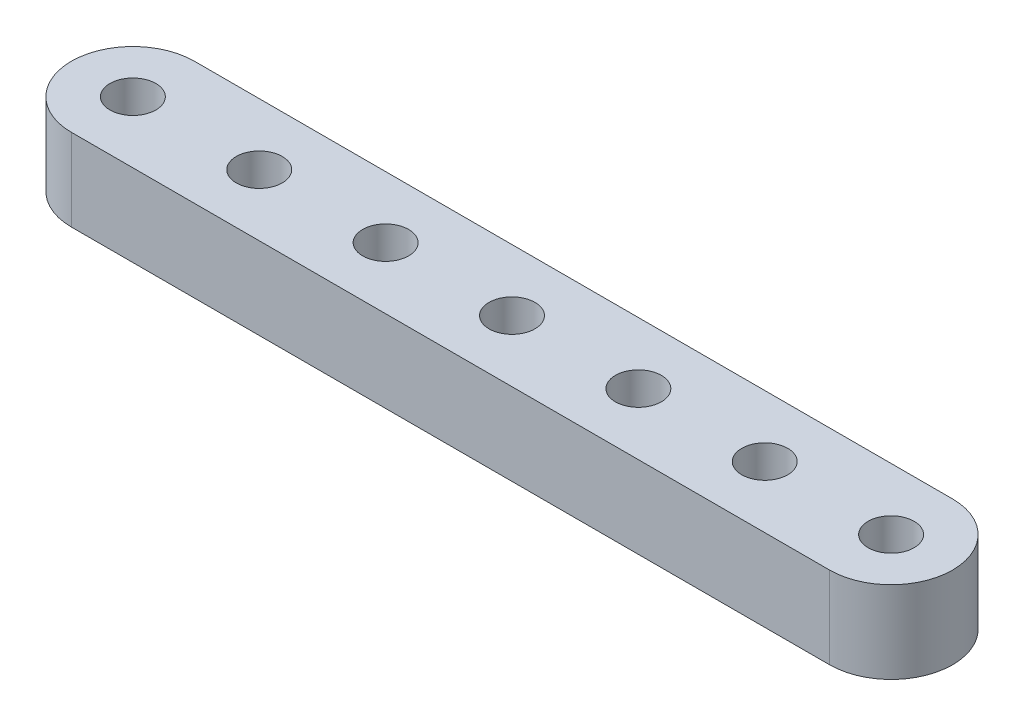
ISO-10303-21;
HEADER;
FILE_DESCRIPTION(('STEP AP214'),'2;1');
FILE_NAME('part.step','',(''),(''),'','','');
FILE_SCHEMA(('AUTOMOTIVE_DESIGN { 1 0 10303 214 1 1 1 1 }'));
ENDSEC;
DATA;
#1=APPLICATION_CONTEXT('core data for automotive mechanical design processes');
#2=APPLICATION_PROTOCOL_DEFINITION('international standard','automotive_design',2000,#1);
#3=PRODUCT_CONTEXT('',#1,'mechanical');
#4=PRODUCT('Part','Part','',(#3));
#5=PRODUCT_RELATED_PRODUCT_CATEGORY('part','',(#4));
#6=PRODUCT_DEFINITION_FORMATION('','',#4);
#7=PRODUCT_DEFINITION_CONTEXT('part definition',#1,'design');
#8=PRODUCT_DEFINITION('design','',#6,#7);
#9=PRODUCT_DEFINITION_SHAPE('','',#8);
#10=(LENGTH_UNIT() NAMED_UNIT(*) SI_UNIT(.MILLI.,.METRE.));
#11=(NAMED_UNIT(*) PLANE_ANGLE_UNIT() SI_UNIT($,.RADIAN.));
#12=(NAMED_UNIT(*) SI_UNIT($,.STERADIAN.) SOLID_ANGLE_UNIT());
#13=UNCERTAINTY_MEASURE_WITH_UNIT(LENGTH_MEASURE(1.E-05),#10,'distance_accuracy_value','');
#14=(GEOMETRIC_REPRESENTATION_CONTEXT(3) GLOBAL_UNCERTAINTY_ASSIGNED_CONTEXT((#13)) GLOBAL_UNIT_ASSIGNED_CONTEXT((#10,
#11,#12)) REPRESENTATION_CONTEXT('',''));
#15=CARTESIAN_POINT('',(0.,0.,0.));
#16=DIRECTION('',(0.,0.,1.));
#17=DIRECTION('',(1.,0.,0.));
#18=AXIS2_PLACEMENT_3D('',#15,#16,#17);
#19=CARTESIAN_POINT('',(-29.337,6.35,0.));
#20=DIRECTION('',(0.,-1.,0.));
#21=DIRECTION('',(0.,0.,-1.));
#22=AXIS2_PLACEMENT_3D('',#19,#20,#21);
#23=CYLINDRICAL_SURFACE('',#22,4.76250000000001);
#24=CARTESIAN_POINT('',(-29.337,0.,0.));
#25=DIRECTION('',(0.,-1.,0.));
#26=DIRECTION('',(0.,0.,-1.));
#27=AXIS2_PLACEMENT_3D('',#24,#25,#26);
#28=CIRCLE('',#27,4.76250000000001);
#29=CARTESIAN_POINT('',(-29.337,0.,4.76250000000001));
#30=VERTEX_POINT('',#29);
#31=CARTESIAN_POINT('',(-29.337,0.,-4.76250000000001));
#32=VERTEX_POINT('',#31);
#33=EDGE_CURVE('E97',#30,#32,#28,.T.);
#34=ORIENTED_EDGE('',*,*,#33,.F.);
#35=DIRECTION('',(0.,-1.,0.));
#36=VECTOR('',#35,1.);
#37=CARTESIAN_POINT('',(-29.337,6.35,4.76250000000001));
#38=LINE('',#37,#36);
#39=CARTESIAN_POINT('',(-29.337,6.35,4.76250000000001));
#40=VERTEX_POINT('',#39);
#41=EDGE_CURVE('E11',#40,#30,#38,.T.);
#42=ORIENTED_EDGE('',*,*,#41,.F.);
#43=CARTESIAN_POINT('',(-29.337,6.35,0.));
#44=DIRECTION('',(0.,-1.,0.));
#45=DIRECTION('',(0.,0.,-1.));
#46=AXIS2_PLACEMENT_3D('',#43,#44,#45);
#47=CIRCLE('',#46,4.76250000000001);
#48=CARTESIAN_POINT('',(-29.337,6.35,-4.76250000000001));
#49=VERTEX_POINT('',#48);
#50=EDGE_CURVE('E90',#40,#49,#47,.T.);
#51=ORIENTED_EDGE('',*,*,#50,.T.);
#52=DIRECTION('',(0.,-1.,0.));
#53=VECTOR('',#52,1.);
#54=CARTESIAN_POINT('',(-29.337,6.35,-4.76250000000001));
#55=LINE('',#54,#53);
#56=EDGE_CURVE('E35',#49,#32,#55,.T.);
#57=ORIENTED_EDGE('',*,*,#56,.T.);
#58=EDGE_LOOP('',(#34,#42,#51,#57));
#59=FACE_BOUND('',#58,.T.);
#60=ADVANCED_FACE('F32',(#59),#23,.T.);
#61=CARTESIAN_POINT('',(29.337,6.35,4.76250000000001));
#62=DIRECTION('',(0.,0.,1.));
#63=DIRECTION('',(1.,0.,0.));
#64=AXIS2_PLACEMENT_3D('',#61,#62,#63);
#65=PLANE('',#64);
#66=DIRECTION('',(-1.,0.,0.));
#67=VECTOR('',#66,1.);
#68=CARTESIAN_POINT('',(29.337,0.,4.76250000000001));
#69=LINE('',#68,#67);
#70=CARTESIAN_POINT('',(29.337,0.,4.76250000000001));
#71=VERTEX_POINT('',#70);
#72=EDGE_CURVE('E92',#71,#30,#69,.T.);
#73=ORIENTED_EDGE('',*,*,#72,.F.);
#74=DIRECTION('',(0.,-1.,0.));
#75=VECTOR('',#74,1.);
#76=CARTESIAN_POINT('',(29.337,6.35,4.76250000000001));
#77=LINE('',#76,#75);
#78=CARTESIAN_POINT('',(29.337,6.35,4.76250000000001));
#79=VERTEX_POINT('',#78);
#80=EDGE_CURVE('E41',#79,#71,#77,.T.);
#81=ORIENTED_EDGE('',*,*,#80,.F.);
#82=DIRECTION('',(-1.,0.,0.));
#83=VECTOR('',#82,1.);
#84=CARTESIAN_POINT('',(29.337,6.35,4.76250000000001));
#85=LINE('',#84,#83);
#86=EDGE_CURVE('E87',#79,#40,#85,.T.);
#87=ORIENTED_EDGE('',*,*,#86,.T.);
#88=ORIENTED_EDGE('',*,*,#41,.T.);
#89=EDGE_LOOP('',(#73,#81,#87,#88));
#90=FACE_BOUND('',#89,.T.);
#91=ADVANCED_FACE('F108',(#90),#65,.T.);
#92=CARTESIAN_POINT('',(29.337,6.35,0.));
#93=DIRECTION('',(0.,-1.,0.));
#94=DIRECTION('',(0.,0.,-1.));
#95=AXIS2_PLACEMENT_3D('',#92,#93,#94);
#96=CYLINDRICAL_SURFACE('',#95,4.76250000000001);
#97=CARTESIAN_POINT('',(29.337,0.,0.));
#98=DIRECTION('',(0.,-1.,0.));
#99=DIRECTION('',(0.,0.,-1.));
#100=AXIS2_PLACEMENT_3D('',#97,#98,#99);
#101=CIRCLE('',#100,4.76250000000001);
#102=CARTESIAN_POINT('',(29.337,0.,-4.76250000000001));
#103=VERTEX_POINT('',#102);
#104=EDGE_CURVE('E82',#103,#71,#101,.T.);
#105=ORIENTED_EDGE('',*,*,#104,.F.);
#106=DIRECTION('',(0.,-1.,0.));
#107=VECTOR('',#106,1.);
#108=CARTESIAN_POINT('',(29.337,6.35,-4.76250000000001));
#109=LINE('',#108,#107);
#110=CARTESIAN_POINT('',(29.337,6.35,-4.76250000000001));
#111=VERTEX_POINT('',#110);
#112=EDGE_CURVE('E77',#111,#103,#109,.T.);
#113=ORIENTED_EDGE('',*,*,#112,.F.);
#114=CARTESIAN_POINT('',(29.337,6.35,0.));
#115=DIRECTION('',(0.,-1.,0.));
#116=DIRECTION('',(0.,0.,-1.));
#117=AXIS2_PLACEMENT_3D('',#114,#115,#116);
#118=CIRCLE('',#117,4.76250000000001);
#119=EDGE_CURVE('E80',#111,#79,#118,.T.);
#120=ORIENTED_EDGE('',*,*,#119,.T.);
#121=ORIENTED_EDGE('',*,*,#80,.T.);
#122=EDGE_LOOP('',(#105,#113,#120,#121));
#123=FACE_BOUND('',#122,.T.);
#124=ADVANCED_FACE('F79',(#123),#96,.T.);
#125=CARTESIAN_POINT('',(-29.337,6.35,-4.76250000000001));
#126=DIRECTION('',(0.,0.,-1.));
#127=DIRECTION('',(-1.,0.,0.));
#128=AXIS2_PLACEMENT_3D('',#125,#126,#127);
#129=PLANE('',#128);
#130=DIRECTION('',(1.,0.,0.));
#131=VECTOR('',#130,1.);
#132=CARTESIAN_POINT('',(-29.337,0.,-4.76250000000001));
#133=LINE('',#132,#131);
#134=EDGE_CURVE('E100',#32,#103,#133,.T.);
#135=ORIENTED_EDGE('',*,*,#134,.F.);
#136=ORIENTED_EDGE('',*,*,#56,.F.);
#137=DIRECTION('',(1.,0.,0.));
#138=VECTOR('',#137,1.);
#139=CARTESIAN_POINT('',(-29.337,6.35,-4.76250000000001));
#140=LINE('',#139,#138);
#141=EDGE_CURVE('E86',#49,#111,#140,.T.);
#142=ORIENTED_EDGE('',*,*,#141,.T.);
#143=ORIENTED_EDGE('',*,*,#112,.T.);
#144=EDGE_LOOP('',(#135,#136,#142,#143));
#145=FACE_BOUND('',#144,.T.);
#146=ADVANCED_FACE('F89',(#145),#129,.T.);
#147=CARTESIAN_POINT('',(-29.337,6.35,0.));
#148=DIRECTION('',(0.,-1.,0.));
#149=DIRECTION('',(0.,0.,-1.));
#150=AXIS2_PLACEMENT_3D('',#147,#148,#149);
#151=PLANE('',#150);
#152=CARTESIAN_POINT('',(-29.337,6.35,0.));
#153=DIRECTION('',(0.,-1.,0.));
#154=DIRECTION('',(0.,0.,1.));
#155=AXIS2_PLACEMENT_3D('',#152,#153,#154);
#156=CIRCLE('',#155,1.77799999999998);
#157=CARTESIAN_POINT('',(-29.337,6.35,1.77799999999999));
#158=VERTEX_POINT('',#157);
#159=EDGE_CURVE('E161',#158,#158,#156,.T.);
#160=ORIENTED_EDGE('',*,*,#159,.T.);
#161=EDGE_LOOP('',(#160));
#162=FACE_BOUND('',#161,.T.);
#163=CARTESIAN_POINT('',(-19.558,6.35,0.));
#164=DIRECTION('',(0.,-1.,0.));
#165=DIRECTION('',(0.,0.,1.));
#166=AXIS2_PLACEMENT_3D('',#163,#164,#165);
#167=CIRCLE('',#166,1.77799999999999);
#168=CARTESIAN_POINT('',(-19.558,6.35,1.77799999999999));
#169=VERTEX_POINT('',#168);
#170=EDGE_CURVE('E169',#169,#169,#167,.T.);
#171=ORIENTED_EDGE('',*,*,#170,.T.);
#172=EDGE_LOOP('',(#171));
#173=FACE_BOUND('',#172,.T.);
#174=CARTESIAN_POINT('',(-9.779,6.35,0.));
#175=DIRECTION('',(0.,-1.,0.));
#176=DIRECTION('',(0.,0.,1.));
#177=AXIS2_PLACEMENT_3D('',#174,#175,#176);
#178=CIRCLE('',#177,1.77799999999999);
#179=CARTESIAN_POINT('',(-9.779,6.35,1.77799999999999));
#180=VERTEX_POINT('',#179);
#181=EDGE_CURVE('E175',#180,#180,#178,.T.);
#182=ORIENTED_EDGE('',*,*,#181,.T.);
#183=EDGE_LOOP('',(#182));
#184=FACE_BOUND('',#183,.T.);
#185=CARTESIAN_POINT('',(0.,6.35,0.));
#186=DIRECTION('',(0.,-1.,0.));
#187=DIRECTION('',(0.,0.,1.));
#188=AXIS2_PLACEMENT_3D('',#185,#186,#187);
#189=CIRCLE('',#188,1.77799999999999);
#190=CARTESIAN_POINT('',(0.,6.35,1.77799999999999));
#191=VERTEX_POINT('',#190);
#192=EDGE_CURVE('E181',#191,#191,#189,.T.);
#193=ORIENTED_EDGE('',*,*,#192,.T.);
#194=EDGE_LOOP('',(#193));
#195=FACE_BOUND('',#194,.T.);
#196=CARTESIAN_POINT('',(9.779,6.35,0.));
#197=DIRECTION('',(0.,-1.,0.));
#198=DIRECTION('',(0.,0.,1.));
#199=AXIS2_PLACEMENT_3D('',#196,#197,#198);
#200=CIRCLE('',#199,1.77799999999999);
#201=CARTESIAN_POINT('',(9.779,6.35,1.77799999999999));
#202=VERTEX_POINT('',#201);
#203=EDGE_CURVE('E187',#202,#202,#200,.T.);
#204=ORIENTED_EDGE('',*,*,#203,.T.);
#205=EDGE_LOOP('',(#204));
#206=FACE_BOUND('',#205,.T.);
#207=CARTESIAN_POINT('',(19.558,6.35,0.));
#208=DIRECTION('',(0.,-1.,0.));
#209=DIRECTION('',(0.,0.,1.));
#210=AXIS2_PLACEMENT_3D('',#207,#208,#209);
#211=CIRCLE('',#210,1.77799999999999);
#212=CARTESIAN_POINT('',(19.558,6.35,1.77799999999999));
#213=VERTEX_POINT('',#212);
#214=EDGE_CURVE('E193',#213,#213,#211,.T.);
#215=ORIENTED_EDGE('',*,*,#214,.T.);
#216=EDGE_LOOP('',(#215));
#217=FACE_BOUND('',#216,.T.);
#218=CARTESIAN_POINT('',(29.337,6.35,0.));
#219=DIRECTION('',(0.,-1.,0.));
#220=DIRECTION('',(0.,0.,1.));
#221=AXIS2_PLACEMENT_3D('',#218,#219,#220);
#222=CIRCLE('',#221,1.77799999999999);
#223=CARTESIAN_POINT('',(29.337,6.35,1.77799999999999));
#224=VERTEX_POINT('',#223);
#225=EDGE_CURVE('E101',#224,#224,#222,.T.);
#226=ORIENTED_EDGE('',*,*,#225,.T.);
#227=EDGE_LOOP('',(#226));
#228=FACE_BOUND('',#227,.T.);
#229=ORIENTED_EDGE('',*,*,#50,.F.);
#230=ORIENTED_EDGE('',*,*,#86,.F.);
#231=ORIENTED_EDGE('',*,*,#119,.F.);
#232=ORIENTED_EDGE('',*,*,#141,.F.);
#233=EDGE_LOOP('',(#229,#230,#231,#232));
#234=FACE_BOUND('',#233,.T.);
#235=ADVANCED_FACE('F85',(#162,#173,#184,#195,#206,#217,#228,#234),#151,.F.);
#236=CARTESIAN_POINT('',(-29.337,0.,0.));
#237=DIRECTION('',(0.,-1.,0.));
#238=DIRECTION('',(0.,0.,-1.));
#239=AXIS2_PLACEMENT_3D('',#236,#237,#238);
#240=PLANE('',#239);
#241=CARTESIAN_POINT('',(-29.337,0.,0.));
#242=DIRECTION('',(0.,-1.,0.));
#243=DIRECTION('',(0.,0.,1.));
#244=AXIS2_PLACEMENT_3D('',#241,#242,#243);
#245=CIRCLE('',#244,1.77799999999998);
#246=CARTESIAN_POINT('',(-29.337,0.,1.77799999999999));
#247=VERTEX_POINT('',#246);
#248=EDGE_CURVE('E164',#247,#247,#245,.T.);
#249=ORIENTED_EDGE('',*,*,#248,.F.);
#250=EDGE_LOOP('',(#249));
#251=FACE_BOUND('',#250,.T.);
#252=CARTESIAN_POINT('',(-19.558,0.,0.));
#253=DIRECTION('',(0.,-1.,0.));
#254=DIRECTION('',(0.,0.,1.));
#255=AXIS2_PLACEMENT_3D('',#252,#253,#254);
#256=CIRCLE('',#255,1.77799999999999);
#257=CARTESIAN_POINT('',(-19.558,0.,1.77799999999999));
#258=VERTEX_POINT('',#257);
#259=EDGE_CURVE('E166',#258,#258,#256,.T.);
#260=ORIENTED_EDGE('',*,*,#259,.F.);
#261=EDGE_LOOP('',(#260));
#262=FACE_BOUND('',#261,.T.);
#263=CARTESIAN_POINT('',(-9.779,0.,0.));
#264=DIRECTION('',(0.,-1.,0.));
#265=DIRECTION('',(0.,0.,1.));
#266=AXIS2_PLACEMENT_3D('',#263,#264,#265);
#267=CIRCLE('',#266,1.77799999999999);
#268=CARTESIAN_POINT('',(-9.779,0.,1.77799999999999));
#269=VERTEX_POINT('',#268);
#270=EDGE_CURVE('E172',#269,#269,#267,.T.);
#271=ORIENTED_EDGE('',*,*,#270,.F.);
#272=EDGE_LOOP('',(#271));
#273=FACE_BOUND('',#272,.T.);
#274=CARTESIAN_POINT('',(0.,0.,0.));
#275=DIRECTION('',(0.,-1.,0.));
#276=DIRECTION('',(0.,0.,1.));
#277=AXIS2_PLACEMENT_3D('',#274,#275,#276);
#278=CIRCLE('',#277,1.77799999999999);
#279=CARTESIAN_POINT('',(0.,0.,1.77799999999999));
#280=VERTEX_POINT('',#279);
#281=EDGE_CURVE('E178',#280,#280,#278,.T.);
#282=ORIENTED_EDGE('',*,*,#281,.F.);
#283=EDGE_LOOP('',(#282));
#284=FACE_BOUND('',#283,.T.);
#285=CARTESIAN_POINT('',(9.779,0.,0.));
#286=DIRECTION('',(0.,-1.,0.));
#287=DIRECTION('',(0.,0.,1.));
#288=AXIS2_PLACEMENT_3D('',#285,#286,#287);
#289=CIRCLE('',#288,1.77799999999999);
#290=CARTESIAN_POINT('',(9.779,0.,1.77799999999999));
#291=VERTEX_POINT('',#290);
#292=EDGE_CURVE('E184',#291,#291,#289,.T.);
#293=ORIENTED_EDGE('',*,*,#292,.F.);
#294=EDGE_LOOP('',(#293));
#295=FACE_BOUND('',#294,.T.);
#296=CARTESIAN_POINT('',(19.558,0.,0.));
#297=DIRECTION('',(0.,-1.,0.));
#298=DIRECTION('',(0.,0.,1.));
#299=AXIS2_PLACEMENT_3D('',#296,#297,#298);
#300=CIRCLE('',#299,1.77799999999999);
#301=CARTESIAN_POINT('',(19.558,0.,1.77799999999999));
#302=VERTEX_POINT('',#301);
#303=EDGE_CURVE('E190',#302,#302,#300,.T.);
#304=ORIENTED_EDGE('',*,*,#303,.F.);
#305=EDGE_LOOP('',(#304));
#306=FACE_BOUND('',#305,.T.);
#307=CARTESIAN_POINT('',(29.337,0.,0.));
#308=DIRECTION('',(0.,-1.,0.));
#309=DIRECTION('',(0.,0.,1.));
#310=AXIS2_PLACEMENT_3D('',#307,#308,#309);
#311=CIRCLE('',#310,1.77799999999999);
#312=CARTESIAN_POINT('',(29.337,0.,1.77799999999999));
#313=VERTEX_POINT('',#312);
#314=EDGE_CURVE('E196',#313,#313,#311,.T.);
#315=ORIENTED_EDGE('',*,*,#314,.F.);
#316=EDGE_LOOP('',(#315));
#317=FACE_BOUND('',#316,.T.);
#318=ORIENTED_EDGE('',*,*,#33,.T.);
#319=ORIENTED_EDGE('',*,*,#134,.T.);
#320=ORIENTED_EDGE('',*,*,#104,.T.);
#321=ORIENTED_EDGE('',*,*,#72,.T.);
#322=EDGE_LOOP('',(#318,#319,#320,#321));
#323=FACE_BOUND('',#322,.T.);
#324=ADVANCED_FACE('F107',(#251,#262,#273,#284,#295,#306,#317,#323),#240,.T.);
#325=CARTESIAN_POINT('',(29.337,6.35,0.));
#326=DIRECTION('',(0.,-1.,0.));
#327=DIRECTION('',(0.,0.,-1.));
#328=AXIS2_PLACEMENT_3D('',#325,#326,#327);
#329=CYLINDRICAL_SURFACE('',#328,1.77799999999999);
#330=ORIENTED_EDGE('',*,*,#225,.F.);
#331=EDGE_LOOP('',(#330));
#332=FACE_BOUND('',#331,.T.);
#333=ORIENTED_EDGE('',*,*,#314,.T.);
#334=EDGE_LOOP('',(#333));
#335=FACE_BOUND('',#334,.T.);
#336=ADVANCED_FACE('F126',(#332,#335),#329,.F.);
#337=CARTESIAN_POINT('',(19.558,6.35,0.));
#338=DIRECTION('',(0.,-1.,0.));
#339=DIRECTION('',(0.,0.,-1.));
#340=AXIS2_PLACEMENT_3D('',#337,#338,#339);
#341=CYLINDRICAL_SURFACE('',#340,1.77799999999999);
#342=ORIENTED_EDGE('',*,*,#214,.F.);
#343=EDGE_LOOP('',(#342));
#344=FACE_BOUND('',#343,.T.);
#345=ORIENTED_EDGE('',*,*,#303,.T.);
#346=EDGE_LOOP('',(#345));
#347=FACE_BOUND('',#346,.T.);
#348=ADVANCED_FACE('F133',(#344,#347),#341,.F.);
#349=CARTESIAN_POINT('',(9.779,6.35,0.));
#350=DIRECTION('',(0.,-1.,0.));
#351=DIRECTION('',(0.,0.,-1.));
#352=AXIS2_PLACEMENT_3D('',#349,#350,#351);
#353=CYLINDRICAL_SURFACE('',#352,1.77799999999999);
#354=ORIENTED_EDGE('',*,*,#203,.F.);
#355=EDGE_LOOP('',(#354));
#356=FACE_BOUND('',#355,.T.);
#357=ORIENTED_EDGE('',*,*,#292,.T.);
#358=EDGE_LOOP('',(#357));
#359=FACE_BOUND('',#358,.T.);
#360=ADVANCED_FACE('F137',(#356,#359),#353,.F.);
#361=CARTESIAN_POINT('',(0.,6.35,0.));
#362=DIRECTION('',(0.,-1.,0.));
#363=DIRECTION('',(0.,0.,-1.));
#364=AXIS2_PLACEMENT_3D('',#361,#362,#363);
#365=CYLINDRICAL_SURFACE('',#364,1.77799999999999);
#366=ORIENTED_EDGE('',*,*,#192,.F.);
#367=EDGE_LOOP('',(#366));
#368=FACE_BOUND('',#367,.T.);
#369=ORIENTED_EDGE('',*,*,#281,.T.);
#370=EDGE_LOOP('',(#369));
#371=FACE_BOUND('',#370,.T.);
#372=ADVANCED_FACE('F141',(#368,#371),#365,.F.);
#373=CARTESIAN_POINT('',(-9.779,6.35,0.));
#374=DIRECTION('',(0.,-1.,0.));
#375=DIRECTION('',(0.,0.,-1.));
#376=AXIS2_PLACEMENT_3D('',#373,#374,#375);
#377=CYLINDRICAL_SURFACE('',#376,1.77799999999999);
#378=ORIENTED_EDGE('',*,*,#181,.F.);
#379=EDGE_LOOP('',(#378));
#380=FACE_BOUND('',#379,.T.);
#381=ORIENTED_EDGE('',*,*,#270,.T.);
#382=EDGE_LOOP('',(#381));
#383=FACE_BOUND('',#382,.T.);
#384=ADVANCED_FACE('F145',(#380,#383),#377,.F.);
#385=CARTESIAN_POINT('',(-19.558,6.35,0.));
#386=DIRECTION('',(0.,-1.,0.));
#387=DIRECTION('',(0.,0.,-1.));
#388=AXIS2_PLACEMENT_3D('',#385,#386,#387);
#389=CYLINDRICAL_SURFACE('',#388,1.77799999999999);
#390=ORIENTED_EDGE('',*,*,#170,.F.);
#391=EDGE_LOOP('',(#390));
#392=FACE_BOUND('',#391,.T.);
#393=ORIENTED_EDGE('',*,*,#259,.T.);
#394=EDGE_LOOP('',(#393));
#395=FACE_BOUND('',#394,.T.);
#396=ADVANCED_FACE('F149',(#392,#395),#389,.F.);
#397=CARTESIAN_POINT('',(-29.337,6.35,0.));
#398=DIRECTION('',(0.,-1.,0.));
#399=DIRECTION('',(0.,0.,-1.));
#400=AXIS2_PLACEMENT_3D('',#397,#398,#399);
#401=CYLINDRICAL_SURFACE('',#400,1.77799999999998);
#402=ORIENTED_EDGE('',*,*,#159,.F.);
#403=EDGE_LOOP('',(#402));
#404=FACE_BOUND('',#403,.T.);
#405=ORIENTED_EDGE('',*,*,#248,.T.);
#406=EDGE_LOOP('',(#405));
#407=FACE_BOUND('',#406,.T.);
#408=ADVANCED_FACE('F153',(#404,#407),#401,.F.);
#409=CLOSED_SHELL('',(#60,#91,#124,#146,#235,#324,#336,#348,#360,#372,#384,#396,#408));
#410=MANIFOLD_SOLID_BREP('B2',#409);
#411=ADVANCED_BREP_SHAPE_REPRESENTATION('',(#18,#410),#14);
#412=SHAPE_DEFINITION_REPRESENTATION(#9,#411);
ENDSEC;
END-ISO-10303-21;
